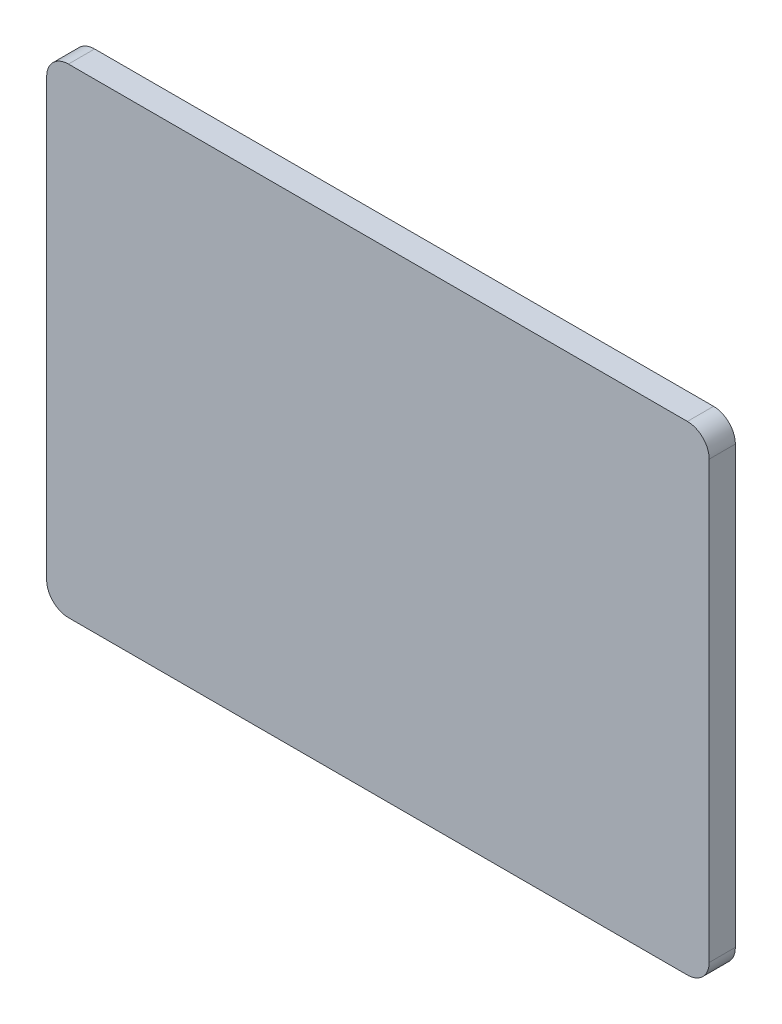
ISO-10303-21;
HEADER;
FILE_DESCRIPTION(('STEP AP214'),'2;1');
FILE_NAME('part.step','',(''),(''),'','','');
FILE_SCHEMA(('AUTOMOTIVE_DESIGN { 1 0 10303 214 1 1 1 1 }'));
ENDSEC;
DATA;
#1=APPLICATION_CONTEXT('core data for automotive mechanical design processes');
#2=APPLICATION_PROTOCOL_DEFINITION('international standard','automotive_design',2000,#1);
#3=PRODUCT_CONTEXT('',#1,'mechanical');
#4=PRODUCT('Part','Part','',(#3));
#5=PRODUCT_RELATED_PRODUCT_CATEGORY('part','',(#4));
#6=PRODUCT_DEFINITION_FORMATION('','',#4);
#7=PRODUCT_DEFINITION_CONTEXT('part definition',#1,'design');
#8=PRODUCT_DEFINITION('design','',#6,#7);
#9=PRODUCT_DEFINITION_SHAPE('','',#8);
#10=(LENGTH_UNIT() NAMED_UNIT(*) SI_UNIT(.MILLI.,.METRE.));
#11=(NAMED_UNIT(*) PLANE_ANGLE_UNIT() SI_UNIT($,.RADIAN.));
#12=(NAMED_UNIT(*) SI_UNIT($,.STERADIAN.) SOLID_ANGLE_UNIT());
#13=UNCERTAINTY_MEASURE_WITH_UNIT(LENGTH_MEASURE(1.E-05),#10,'distance_accuracy_value','');
#14=(GEOMETRIC_REPRESENTATION_CONTEXT(3) GLOBAL_UNCERTAINTY_ASSIGNED_CONTEXT((#13)) GLOBAL_UNIT_ASSIGNED_CONTEXT((#10,
#11,#12)) REPRESENTATION_CONTEXT('',''));
#15=CARTESIAN_POINT('',(0.,0.,0.));
#16=DIRECTION('',(0.,0.,1.));
#17=DIRECTION('',(1.,0.,0.));
#18=AXIS2_PLACEMENT_3D('',#15,#16,#17);
#19=CARTESIAN_POINT('',(-1.52,-1.1,0.7));
#20=DIRECTION('',(0.,0.,1.));
#21=DIRECTION('',(1.,0.,0.));
#22=AXIS2_PLACEMENT_3D('',#19,#20,#21);
#23=PLANE('',#22);
#24=CARTESIAN_POINT('',(-1.52,1.000000000006,0.7));
#25=CARTESIAN_POINT('',(-1.51999968844048,1.0056316202386,0.7));
#26=CARTESIAN_POINT('',(-1.51952299246332,1.01125312673214,0.7));
#27=CARTESIAN_POINT('',(-1.51763681382996,1.02233274194425,0.7));
#28=CARTESIAN_POINT('',(-1.5162280630371,1.02779097535536,0.7));
#29=CARTESIAN_POINT('',(-1.51064431334291,1.04368613131699,0.7));
#30=CARTESIAN_POINT('',(-1.5051115492291,1.05368086111718,0.7));
#31=CARTESIAN_POINT('',(-1.49106257026605,1.07125770138423,0.7));
#32=CARTESIAN_POINT('',(-1.48254635541698,1.07883981185122,0.7));
#33=CARTESIAN_POINT('',(-1.4634686777282,1.09075031978158,0.7));
#34=CARTESIAN_POINT('',(-1.45290721488826,1.09507871724458,0.7));
#35=CARTESIAN_POINT('',(-1.43474534601436,1.09919358451577,0.7));
#36=CARTESIAN_POINT('',(-1.42736844369791,1.10002745083091,0.7));
#37=CARTESIAN_POINT('',(-1.42000000002417,1.1,0.7));
#38=B_SPLINE_CURVE_WITH_KNOTS('',3,(#24,#25,#26,#27,#28,#29,#30,#31,#32,#33,#34,#35,#36,#37),
.UNSPECIFIED.,.F.,.F.,(4,2,2,2,2,2,4),(0.,0.0168550694012489,0.0336969196328669,
0.0672740568307237,0.100851194026678,0.134428331226493,0.156515205370961),.UNSPECIFIED.);
#39=CARTESIAN_POINT('',(-1.52,1.000000000006,0.7));
#40=VERTEX_POINT('',#39);
#41=CARTESIAN_POINT('',(-1.42,1.1,0.7));
#42=VERTEX_POINT('',#41);
#43=EDGE_CURVE('E100',#40,#42,#38,.T.);
#44=ORIENTED_EDGE('',*,*,#43,.F.);
#45=DIRECTION('',(0.,1.,0.));
#46=VECTOR('',#45,1.);
#47=CARTESIAN_POINT('',(-1.52,-1.,0.7));
#48=LINE('',#47,#46);
#49=CARTESIAN_POINT('',(-1.52,-1.00000000001208,0.7));
#50=VERTEX_POINT('',#49);
#51=EDGE_CURVE('E108',#50,#40,#48,.T.);
#52=ORIENTED_EDGE('',*,*,#51,.F.);
#53=CARTESIAN_POINT('',(-1.42,-1.1,0.7));
#54=CARTESIAN_POINT('',(-1.4256316202326,-1.09999968844081,0.7));
#55=CARTESIAN_POINT('',(-1.43125312672617,-1.09952299246399,0.7));
#56=CARTESIAN_POINT('',(-1.44233274193839,-1.0976368138313,0.7));
#57=CARTESIAN_POINT('',(-1.44779097534958,-1.09622806303877,0.7));
#58=CARTESIAN_POINT('',(-1.46368613131155,-1.09064431334553,0.7));
#59=CARTESIAN_POINT('',(-1.47368086111208,-1.08511154923233,0.7));
#60=CARTESIAN_POINT('',(-1.49125770137997,-1.07106257027033,0.7));
#61=CARTESIAN_POINT('',(-1.49883981184747,-1.06254635542171,0.7));
#62=CARTESIAN_POINT('',(-1.51075031977897,-1.04346867773365,0.7));
#63=CARTESIAN_POINT('',(-1.5150787172426,-1.03290721489397,0.7));
#64=CARTESIAN_POINT('',(-1.51919358451533,-1.01474534601836,0.7));
#65=CARTESIAN_POINT('',(-1.52002745083093,-1.00736844369991,0.7));
#66=CARTESIAN_POINT('',(-1.52,-1.00000000002417,0.7));
#67=B_SPLINE_CURVE_WITH_KNOTS('',3,(#53,#54,#55,#56,#57,#58,#59,#60,#61,#62,#63,#64,#65,#66),
.UNSPECIFIED.,.F.,.F.,(4,2,2,2,2,2,4),(0.,0.0168550694012493,0.033696919632867,
0.0672740568307241,0.100851194026678,0.134428331226493,0.156515205376924),.UNSPECIFIED.);
#68=CARTESIAN_POINT('',(-1.42,-1.1,0.7));
#69=VERTEX_POINT('',#68);
#70=EDGE_CURVE('E154',#69,#50,#67,.T.);
#71=ORIENTED_EDGE('',*,*,#70,.F.);
#72=DIRECTION('',(1.,0.,0.));
#73=VECTOR('',#72,1.);
#74=CARTESIAN_POINT('',(1.42,-1.1,0.7));
#75=LINE('',#74,#73);
#76=CARTESIAN_POINT('',(1.42000000001208,-1.1,0.7));
#77=VERTEX_POINT('',#76);
#78=EDGE_CURVE('E111',#77,#69,#75,.F.);
#79=ORIENTED_EDGE('',*,*,#78,.F.);
#80=CARTESIAN_POINT('',(1.52,-1.,0.7));
#81=CARTESIAN_POINT('',(1.51999968844081,-1.0056316202326,0.7));
#82=CARTESIAN_POINT('',(1.51952299246399,-1.01125312672617,0.7));
#83=CARTESIAN_POINT('',(1.5176368138313,-1.02233274193839,0.7));
#84=CARTESIAN_POINT('',(1.51622806303877,-1.02779097534958,0.7));
#85=CARTESIAN_POINT('',(1.51064431334553,-1.04368613131155,0.7));
#86=CARTESIAN_POINT('',(1.50511154923233,-1.05368086111208,0.7));
#87=CARTESIAN_POINT('',(1.49106257027033,-1.07125770137997,0.7));
#88=CARTESIAN_POINT('',(1.48254635542171,-1.07883981184747,0.7));
#89=CARTESIAN_POINT('',(1.46346867773365,-1.09075031977897,0.7));
#90=CARTESIAN_POINT('',(1.45290721489397,-1.0950787172426,0.7));
#91=CARTESIAN_POINT('',(1.43474534601836,-1.09919358451533,0.7));
#92=CARTESIAN_POINT('',(1.42736844369991,-1.10002745083093,0.7));
#93=CARTESIAN_POINT('',(1.42000000002417,-1.1,0.7));
#94=B_SPLINE_CURVE_WITH_KNOTS('',3,(#80,#81,#82,#83,#84,#85,#86,#87,#88,#89,#90,#91,#92,#93),
.UNSPECIFIED.,.F.,.F.,(4,2,2,2,2,2,4),(0.,0.0168550694012493,0.0336969196328673,
0.0672740568307246,0.100851194026678,0.134428331226493,0.156515205376924),.UNSPECIFIED.);
#95=CARTESIAN_POINT('',(1.52,-1.,0.7));
#96=VERTEX_POINT('',#95);
#97=EDGE_CURVE('E158',#96,#77,#94,.T.);
#98=ORIENTED_EDGE('',*,*,#97,.F.);
#99=DIRECTION('',(0.,1.,0.));
#100=VECTOR('',#99,1.);
#101=CARTESIAN_POINT('',(1.52,1.,0.7));
#102=LINE('',#101,#100);
#103=CARTESIAN_POINT('',(1.52,1.,0.7));
#104=VERTEX_POINT('',#103);
#105=EDGE_CURVE('E89',#104,#96,#102,.F.);
#106=ORIENTED_EDGE('',*,*,#105,.F.);
#107=CARTESIAN_POINT('',(1.42,1.1,0.7));
#108=CARTESIAN_POINT('',(1.4256316202326,1.09999968844081,0.7));
#109=CARTESIAN_POINT('',(1.43125312672617,1.09952299246399,0.7));
#110=CARTESIAN_POINT('',(1.44233274193839,1.0976368138313,0.7));
#111=CARTESIAN_POINT('',(1.44779097534958,1.09622806303877,0.7));
#112=CARTESIAN_POINT('',(1.46368613131155,1.09064431334553,0.7));
#113=CARTESIAN_POINT('',(1.47368086111208,1.08511154923233,0.7));
#114=CARTESIAN_POINT('',(1.49125770137997,1.07106257027033,0.7));
#115=CARTESIAN_POINT('',(1.49883981184747,1.06254635542171,0.7));
#116=CARTESIAN_POINT('',(1.51075031977897,1.04346867773365,0.7));
#117=CARTESIAN_POINT('',(1.5150787172426,1.03290721489397,0.7));
#118=CARTESIAN_POINT('',(1.51919358451533,1.01474534601836,0.7));
#119=CARTESIAN_POINT('',(1.52002745083093,1.00736844369991,0.7));
#120=CARTESIAN_POINT('',(1.52,1.00000000002417,0.7));
#121=B_SPLINE_CURVE_WITH_KNOTS('',3,(#107,#108,#109,#110,#111,#112,#113,#114,#115,#116,#117,
#118,#119,#120),.UNSPECIFIED.,.F.,.F.,(4,2,2,2,2,2,4),(0.,0.0168550694012493,0.0336969196328672,
0.0672740568307246,0.100851194026679,0.134428331226493,0.156515205376924),.UNSPECIFIED.);
#122=CARTESIAN_POINT('',(1.42,1.1,0.7));
#123=VERTEX_POINT('',#122);
#124=EDGE_CURVE('E21',#123,#104,#121,.T.);
#125=ORIENTED_EDGE('',*,*,#124,.F.);
#126=DIRECTION('',(1.,0.,0.));
#127=VECTOR('',#126,1.);
#128=CARTESIAN_POINT('',(-1.42,1.1,0.7));
#129=LINE('',#128,#127);
#130=EDGE_CURVE('E87',#42,#123,#129,.T.);
#131=ORIENTED_EDGE('',*,*,#130,.F.);
#132=EDGE_LOOP('',(#44,#52,#71,#79,#98,#106,#125,#131));
#133=FACE_BOUND('',#132,.T.);
#134=ADVANCED_FACE('F17',(#133),#23,.T.);
#135=CARTESIAN_POINT('',(1.418585786438,1.1,0.58));
#136=CARTESIAN_POINT('',(1.419292893219,1.1,0.58));
#137=CARTESIAN_POINT('',(1.42,1.1,0.58));
#138=CARTESIAN_POINT('',(1.52,1.1,0.58));
#139=CARTESIAN_POINT('',(1.52,1.,0.58));
#140=CARTESIAN_POINT('',(1.418585786438,1.1,0.62));
#141=CARTESIAN_POINT('',(1.419292893219,1.1,0.62));
#142=CARTESIAN_POINT('',(1.42,1.1,0.62));
#143=CARTESIAN_POINT('',(1.52,1.1,0.62));
#144=CARTESIAN_POINT('',(1.52,1.,0.62));
#145=CARTESIAN_POINT('',(1.418585786438,1.1,0.66));
#146=CARTESIAN_POINT('',(1.419292893219,1.1,0.66));
#147=CARTESIAN_POINT('',(1.42,1.1,0.66));
#148=CARTESIAN_POINT('',(1.52,1.1,0.66));
#149=CARTESIAN_POINT('',(1.52,1.,0.66));
#150=CARTESIAN_POINT('',(1.418585786438,1.1,0.7));
#151=CARTESIAN_POINT('',(1.419292893219,1.1,0.7));
#152=CARTESIAN_POINT('',(1.42,1.1,0.7));
#153=CARTESIAN_POINT('',(1.52,1.1,0.7));
#154=CARTESIAN_POINT('',(1.52,1.,0.7));
#155=(BOUNDED_SURFACE() B_SPLINE_SURFACE(3,2,((#135,#136,#137,#138,#139),(#140,#141,#142,#143,
#144),(#145,#146,#147,#148,#149),(#150,#151,#152,#153,#154)),.UNSPECIFIED.,.F.,.F.,
.F.) B_SPLINE_SURFACE_WITH_KNOTS((4,4),(3,2,3),(0.,0.12),(-0.01,0.,1.),
.UNSPECIFIED.) GEOMETRIC_REPRESENTATION_ITEM() RATIONAL_B_SPLINE_SURFACE(((1.,1.,1.,
0.707106781187,1.),(1.,1.,1.,0.707106781187,1.),(1.,1.,1.,0.707106781187,1.),(1.,1.,1.,
0.707106781187,1.))) REPRESENTATION_ITEM('') SURFACE());
#156=DIRECTION('',(0.,0.,1.));
#157=VECTOR('',#156,1.);
#158=CARTESIAN_POINT('',(1.42,1.1,0.58));
#159=LINE('',#158,#157);
#160=CARTESIAN_POINT('',(1.42,1.1,0.58));
#161=VERTEX_POINT('',#160);
#162=EDGE_CURVE('E93',#123,#161,#159,.F.);
#163=DIRECTION('',(0.,0.,-1.));
#164=VECTOR('',#163,1.);
#165=CARTESIAN_POINT('',(1.52,1.,0.58));
#166=LINE('',#165,#164);
#167=CARTESIAN_POINT('',(1.52,1.,0.58));
#168=VERTEX_POINT('',#167);
#169=EDGE_CURVE('E106',#168,#104,#166,.F.);
#170=CARTESIAN_POINT('',(1.42,1.1,0.58));
#171=CARTESIAN_POINT('',(1.4256316202326,1.09999968844081,0.58));
#172=CARTESIAN_POINT('',(1.43125312672617,1.09952299246399,0.58));
#173=CARTESIAN_POINT('',(1.44233274193839,1.0976368138313,0.58));
#174=CARTESIAN_POINT('',(1.44779097534958,1.09622806303877,0.58));
#175=CARTESIAN_POINT('',(1.46368613131155,1.09064431334553,0.58));
#176=CARTESIAN_POINT('',(1.47368086111208,1.08511154923233,0.58));
#177=CARTESIAN_POINT('',(1.49125770137997,1.07106257027033,0.58));
#178=CARTESIAN_POINT('',(1.49883981184747,1.06254635542171,0.58));
#179=CARTESIAN_POINT('',(1.51075031977897,1.04346867773365,0.58));
#180=CARTESIAN_POINT('',(1.5150787172426,1.03290721489397,0.58));
#181=CARTESIAN_POINT('',(1.51919358451533,1.01474534601836,0.58));
#182=CARTESIAN_POINT('',(1.52002745083093,1.00736844369991,0.58));
#183=CARTESIAN_POINT('',(1.52,1.00000000002417,0.58));
#184=B_SPLINE_CURVE_WITH_KNOTS('',3,(#170,#171,#172,#173,#174,#175,#176,#177,#178,#179,#180,
#181,#182,#183),.UNSPECIFIED.,.F.,.F.,(4,2,2,2,2,2,4),(0.,0.0168550694012497,0.0336969196328675,
0.0672740568307245,0.100851194026679,0.134428331226494,0.156515205376924),.UNSPECIFIED.);
#185=EDGE_CURVE('E96',#161,#168,#184,.T.);
#186=ORIENTED_EDGE('',*,*,#162,.F.);
#187=ORIENTED_EDGE('',*,*,#124,.T.);
#188=ORIENTED_EDGE('',*,*,#169,.F.);
#189=ORIENTED_EDGE('',*,*,#185,.F.);
#190=EDGE_LOOP('',(#186,#187,#188,#189));
#191=FACE_BOUND('',#190,.T.);
#192=ADVANCED_FACE('F94',(#191),#155,.T.);
#193=CARTESIAN_POINT('',(1.52,1.,0.58));
#194=DIRECTION('',(1.,0.,0.));
#195=DIRECTION('',(0.,0.,-1.));
#196=AXIS2_PLACEMENT_3D('',#193,#194,#195);
#197=PLANE('',#196);
#198=DIRECTION('',(0.,1.,0.));
#199=VECTOR('',#198,1.);
#200=CARTESIAN_POINT('',(1.52,-1.1,0.58));
#201=LINE('',#200,#199);
#202=CARTESIAN_POINT('',(1.52,-1.,0.58));
#203=VERTEX_POINT('',#202);
#204=EDGE_CURVE('E199',#168,#203,#201,.F.);
#205=ORIENTED_EDGE('',*,*,#204,.F.);
#206=ORIENTED_EDGE('',*,*,#169,.T.);
#207=ORIENTED_EDGE('',*,*,#105,.T.);
#208=DIRECTION('',(0.,0.,1.));
#209=VECTOR('',#208,1.);
#210=CARTESIAN_POINT('',(1.52,-1.,0.64));
#211=LINE('',#210,#209);
#212=EDGE_CURVE('E217',#203,#96,#211,.T.);
#213=ORIENTED_EDGE('',*,*,#212,.F.);
#214=EDGE_LOOP('',(#205,#206,#207,#213));
#215=FACE_BOUND('',#214,.T.);
#216=ADVANCED_FACE('F185',(#215),#197,.T.);
#217=CARTESIAN_POINT('',(1.52,-0.998585786438,0.58));
#218=CARTESIAN_POINT('',(1.52,-0.999292893219,0.58));
#219=CARTESIAN_POINT('',(1.52,-1.,0.58));
#220=CARTESIAN_POINT('',(1.52,-1.1,0.58));
#221=CARTESIAN_POINT('',(1.42,-1.1,0.58));
#222=CARTESIAN_POINT('',(1.52,-0.998585786438,0.62));
#223=CARTESIAN_POINT('',(1.52,-0.999292893219,0.62));
#224=CARTESIAN_POINT('',(1.52,-1.,0.62));
#225=CARTESIAN_POINT('',(1.52,-1.1,0.62));
#226=CARTESIAN_POINT('',(1.42,-1.1,0.62));
#227=CARTESIAN_POINT('',(1.52,-0.998585786438,0.66));
#228=CARTESIAN_POINT('',(1.52,-0.999292893219,0.66));
#229=CARTESIAN_POINT('',(1.52,-1.,0.66));
#230=CARTESIAN_POINT('',(1.52,-1.1,0.66));
#231=CARTESIAN_POINT('',(1.42,-1.1,0.66));
#232=CARTESIAN_POINT('',(1.52,-0.998585786438,0.7));
#233=CARTESIAN_POINT('',(1.52,-0.999292893219,0.7));
#234=CARTESIAN_POINT('',(1.52,-1.,0.7));
#235=CARTESIAN_POINT('',(1.52,-1.1,0.7));
#236=CARTESIAN_POINT('',(1.42,-1.1,0.7));
#237=(BOUNDED_SURFACE() B_SPLINE_SURFACE(3,2,((#217,#218,#219,#220,#221),(#222,#223,#224,#225,
#226),(#227,#228,#229,#230,#231),(#232,#233,#234,#235,#236)),.UNSPECIFIED.,.F.,.F.,
.F.) B_SPLINE_SURFACE_WITH_KNOTS((4,4),(3,2,3),(0.,0.12),(-0.01,0.,1.),
.UNSPECIFIED.) GEOMETRIC_REPRESENTATION_ITEM() RATIONAL_B_SPLINE_SURFACE(((1.,1.,1.,
0.707106781187,1.),(1.,1.,1.,0.707106781187,1.),(1.,1.,1.,0.707106781187,1.),(1.,1.,1.,
0.707106781187,1.))) REPRESENTATION_ITEM('') SURFACE());
#238=DIRECTION('',(0.,0.,-1.));
#239=VECTOR('',#238,1.);
#240=CARTESIAN_POINT('',(1.42,-1.1,0.58));
#241=LINE('',#240,#239);
#242=CARTESIAN_POINT('',(1.42,-1.1,0.58));
#243=VERTEX_POINT('',#242);
#244=EDGE_CURVE('E114',#243,#77,#241,.F.);
#245=CARTESIAN_POINT('',(1.52,-1.,0.58));
#246=CARTESIAN_POINT('',(1.51999968844081,-1.0056316202326,0.58));
#247=CARTESIAN_POINT('',(1.51952299246399,-1.01125312672617,0.58));
#248=CARTESIAN_POINT('',(1.5176368138313,-1.02233274193839,0.58));
#249=CARTESIAN_POINT('',(1.51622806303877,-1.02779097534958,0.58));
#250=CARTESIAN_POINT('',(1.51064431334553,-1.04368613131155,0.58));
#251=CARTESIAN_POINT('',(1.50511154923233,-1.05368086111208,0.58));
#252=CARTESIAN_POINT('',(1.49106257027033,-1.07125770137997,0.58));
#253=CARTESIAN_POINT('',(1.48254635542171,-1.07883981184747,0.58));
#254=CARTESIAN_POINT('',(1.46346867773365,-1.09075031977897,0.58));
#255=CARTESIAN_POINT('',(1.45290721489397,-1.0950787172426,0.58));
#256=CARTESIAN_POINT('',(1.43474534601836,-1.09919358451533,0.58));
#257=CARTESIAN_POINT('',(1.42736844369991,-1.10002745083093,0.58));
#258=CARTESIAN_POINT('',(1.42000000002417,-1.1,0.58));
#259=B_SPLINE_CURVE_WITH_KNOTS('',3,(#245,#246,#247,#248,#249,#250,#251,#252,#253,#254,#255,
#256,#257,#258),.UNSPECIFIED.,.F.,.F.,(4,2,2,2,2,2,4),(0.,0.0168550694012493,0.0336969196328673,
0.0672740568307245,0.100851194026678,0.134428331226493,0.156515205376924),.UNSPECIFIED.);
#260=EDGE_CURVE('E193',#203,#243,#259,.T.);
#261=ORIENTED_EDGE('',*,*,#212,.T.);
#262=ORIENTED_EDGE('',*,*,#97,.T.);
#263=ORIENTED_EDGE('',*,*,#244,.F.);
#264=ORIENTED_EDGE('',*,*,#260,.F.);
#265=EDGE_LOOP('',(#261,#262,#263,#264));
#266=FACE_BOUND('',#265,.T.);
#267=ADVANCED_FACE('F178',(#266),#237,.T.);
#268=CARTESIAN_POINT('',(1.42,-1.1,0.58));
#269=DIRECTION('',(0.,-1.,0.));
#270=DIRECTION('',(0.,0.,-1.));
#271=AXIS2_PLACEMENT_3D('',#268,#269,#270);
#272=PLANE('',#271);
#273=ORIENTED_EDGE('',*,*,#244,.T.);
#274=ORIENTED_EDGE('',*,*,#78,.T.);
#275=DIRECTION('',(0.,0.,1.));
#276=VECTOR('',#275,1.);
#277=CARTESIAN_POINT('',(-1.42,-1.1,0.64));
#278=LINE('',#277,#276);
#279=CARTESIAN_POINT('',(-1.420000000003,-1.1,0.58));
#280=VERTEX_POINT('',#279);
#281=EDGE_CURVE('E113',#280,#69,#278,.T.);
#282=ORIENTED_EDGE('',*,*,#281,.F.);
#283=DIRECTION('',(-1.,0.,0.));
#284=VECTOR('',#283,1.);
#285=CARTESIAN_POINT('',(-1.52,-1.1,0.58));
#286=LINE('',#285,#284);
#287=EDGE_CURVE('E198',#243,#280,#286,.T.);
#288=ORIENTED_EDGE('',*,*,#287,.F.);
#289=EDGE_LOOP('',(#273,#274,#282,#288));
#290=FACE_BOUND('',#289,.T.);
#291=ADVANCED_FACE('F169',(#290),#272,.T.);
#292=CARTESIAN_POINT('',(-1.52,-0.998585786438,0.7));
#293=CARTESIAN_POINT('',(-1.52,-0.999292893219,0.7));
#294=CARTESIAN_POINT('',(-1.52,-1.,0.7));
#295=CARTESIAN_POINT('',(-1.52,-1.1,0.7));
#296=CARTESIAN_POINT('',(-1.42,-1.1,0.7));
#297=CARTESIAN_POINT('',(-1.52,-0.998585786438,0.66));
#298=CARTESIAN_POINT('',(-1.52,-0.999292893219,0.66));
#299=CARTESIAN_POINT('',(-1.52,-1.,0.66));
#300=CARTESIAN_POINT('',(-1.52,-1.1,0.66));
#301=CARTESIAN_POINT('',(-1.42,-1.1,0.66));
#302=CARTESIAN_POINT('',(-1.52,-0.998585786438,0.62));
#303=CARTESIAN_POINT('',(-1.52,-0.999292893219,0.62));
#304=CARTESIAN_POINT('',(-1.52,-1.,0.62));
#305=CARTESIAN_POINT('',(-1.52,-1.1,0.62));
#306=CARTESIAN_POINT('',(-1.42,-1.1,0.62));
#307=CARTESIAN_POINT('',(-1.52,-0.998585786438,0.58));
#308=CARTESIAN_POINT('',(-1.52,-0.999292893219,0.58));
#309=CARTESIAN_POINT('',(-1.52,-1.,0.58));
#310=CARTESIAN_POINT('',(-1.52,-1.1,0.58));
#311=CARTESIAN_POINT('',(-1.42,-1.1,0.58));
#312=(BOUNDED_SURFACE() B_SPLINE_SURFACE(3,2,((#292,#293,#294,#295,#296),(#297,#298,#299,#300,
#301),(#302,#303,#304,#305,#306),(#307,#308,#309,#310,#311)),.UNSPECIFIED.,.F.,.F.,
.F.) B_SPLINE_SURFACE_WITH_KNOTS((4,4),(3,2,3),(0.,0.12),(-0.01,0.,1.),
.UNSPECIFIED.) GEOMETRIC_REPRESENTATION_ITEM() RATIONAL_B_SPLINE_SURFACE(((1.,1.,1.,
0.707106781187,1.),(1.,1.,1.,0.707106781187,1.),(1.,1.,1.,0.707106781187,1.),(1.,1.,1.,
0.707106781187,1.))) REPRESENTATION_ITEM('') SURFACE());
#313=DIRECTION('',(0.,0.,1.));
#314=VECTOR('',#313,1.);
#315=CARTESIAN_POINT('',(-1.52,-1.,0.58));
#316=LINE('',#315,#314);
#317=CARTESIAN_POINT('',(-1.52,-1.,0.58));
#318=VERTEX_POINT('',#317);
#319=EDGE_CURVE('E110',#318,#50,#316,.T.);
#320=CARTESIAN_POINT('',(-1.420000000006,-1.1,0.58));
#321=CARTESIAN_POINT('',(-1.4256316202386,-1.09999968844048,0.58));
#322=CARTESIAN_POINT('',(-1.43125312673214,-1.09952299246332,0.58));
#323=CARTESIAN_POINT('',(-1.44233274194425,-1.09763681382996,0.58));
#324=CARTESIAN_POINT('',(-1.44779097535536,-1.0962280630371,0.58));
#325=CARTESIAN_POINT('',(-1.46368613131699,-1.09064431334291,0.58));
#326=CARTESIAN_POINT('',(-1.47368086111718,-1.0851115492291,0.58));
#327=CARTESIAN_POINT('',(-1.49125770138423,-1.07106257026605,0.58));
#328=CARTESIAN_POINT('',(-1.49883981185122,-1.06254635541698,0.58));
#329=CARTESIAN_POINT('',(-1.51075031978158,-1.0434686777282,0.58));
#330=CARTESIAN_POINT('',(-1.51507871724458,-1.03290721488826,0.58));
#331=CARTESIAN_POINT('',(-1.51919358451577,-1.01474534601436,0.58));
#332=CARTESIAN_POINT('',(-1.52002745083091,-1.00736844369791,0.58));
#333=CARTESIAN_POINT('',(-1.52,-1.00000000002417,0.58));
#334=B_SPLINE_CURVE_WITH_KNOTS('',3,(#320,#321,#322,#323,#324,#325,#326,#327,#328,#329,#330,
#331,#332,#333),.UNSPECIFIED.,.F.,.F.,(4,2,2,2,2,2,4),(0.,0.0168550694012487,0.0336969196328666,
0.0672740568307233,0.100851194026677,0.134428331226492,0.15651520537096),.UNSPECIFIED.);
#335=EDGE_CURVE('E124',#280,#318,#334,.T.);
#336=ORIENTED_EDGE('',*,*,#319,.F.);
#337=ORIENTED_EDGE('',*,*,#335,.F.);
#338=ORIENTED_EDGE('',*,*,#281,.T.);
#339=ORIENTED_EDGE('',*,*,#70,.T.);
#340=EDGE_LOOP('',(#336,#337,#338,#339));
#341=FACE_BOUND('',#340,.T.);
#342=ADVANCED_FACE('F163',(#341),#312,.T.);
#343=CARTESIAN_POINT('',(-1.52,-1.,0.58));
#344=DIRECTION('',(-1.,0.,0.));
#345=DIRECTION('',(0.,0.,1.));
#346=AXIS2_PLACEMENT_3D('',#343,#344,#345);
#347=PLANE('',#346);
#348=ORIENTED_EDGE('',*,*,#51,.T.);
#349=DIRECTION('',(0.,0.,1.));
#350=VECTOR('',#349,1.);
#351=CARTESIAN_POINT('',(-1.52,1.000000000012,0.64));
#352=LINE('',#351,#350);
#353=CARTESIAN_POINT('',(-1.52,1.000000000012,0.58));
#354=VERTEX_POINT('',#353);
#355=EDGE_CURVE('E102',#354,#40,#352,.T.);
#356=ORIENTED_EDGE('',*,*,#355,.F.);
#357=DIRECTION('',(0.,1.,0.));
#358=VECTOR('',#357,1.);
#359=CARTESIAN_POINT('',(-1.52,-1.1,0.58));
#360=LINE('',#359,#358);
#361=EDGE_CURVE('E123',#318,#354,#360,.T.);
#362=ORIENTED_EDGE('',*,*,#361,.F.);
#363=ORIENTED_EDGE('',*,*,#319,.T.);
#364=EDGE_LOOP('',(#348,#356,#362,#363));
#365=FACE_BOUND('',#364,.T.);
#366=ADVANCED_FACE('F139',(#365),#347,.T.);
#367=CARTESIAN_POINT('',(-1.52,0.998585786438,0.58));
#368=CARTESIAN_POINT('',(-1.52,0.999292893219,0.58));
#369=CARTESIAN_POINT('',(-1.52,1.,0.58));
#370=CARTESIAN_POINT('',(-1.52,1.1,0.58));
#371=CARTESIAN_POINT('',(-1.42,1.1,0.58));
#372=CARTESIAN_POINT('',(-1.52,0.998585786438,0.62));
#373=CARTESIAN_POINT('',(-1.52,0.999292893219,0.62));
#374=CARTESIAN_POINT('',(-1.52,1.,0.62));
#375=CARTESIAN_POINT('',(-1.52,1.1,0.62));
#376=CARTESIAN_POINT('',(-1.42,1.1,0.62));
#377=CARTESIAN_POINT('',(-1.52,0.998585786438,0.66));
#378=CARTESIAN_POINT('',(-1.52,0.999292893219,0.66));
#379=CARTESIAN_POINT('',(-1.52,1.,0.66));
#380=CARTESIAN_POINT('',(-1.52,1.1,0.66));
#381=CARTESIAN_POINT('',(-1.42,1.1,0.66));
#382=CARTESIAN_POINT('',(-1.52,0.998585786438,0.7));
#383=CARTESIAN_POINT('',(-1.52,0.999292893219,0.7));
#384=CARTESIAN_POINT('',(-1.52,1.,0.7));
#385=CARTESIAN_POINT('',(-1.52,1.1,0.7));
#386=CARTESIAN_POINT('',(-1.42,1.1,0.7));
#387=(BOUNDED_SURFACE() B_SPLINE_SURFACE(3,2,((#367,#368,#369,#370,#371),(#372,#373,#374,#375,
#376),(#377,#378,#379,#380,#381),(#382,#383,#384,#385,#386)),.UNSPECIFIED.,.F.,.F.,
.F.) B_SPLINE_SURFACE_WITH_KNOTS((4,4),(3,2,3),(0.,0.12),(-0.01,0.,1.),
.UNSPECIFIED.) GEOMETRIC_REPRESENTATION_ITEM() RATIONAL_B_SPLINE_SURFACE(((1.,1.,1.,
0.707106781187,1.),(1.,1.,1.,0.707106781187,1.),(1.,1.,1.,0.707106781187,1.),(1.,1.,1.,
0.707106781187,1.))) REPRESENTATION_ITEM('') SURFACE());
#388=DIRECTION('',(0.,0.,1.));
#389=VECTOR('',#388,1.);
#390=CARTESIAN_POINT('',(-1.42,1.1,0.58));
#391=LINE('',#390,#389);
#392=CARTESIAN_POINT('',(-1.42,1.1,0.58));
#393=VERTEX_POINT('',#392);
#394=EDGE_CURVE('E39',#393,#42,#391,.T.);
#395=CARTESIAN_POINT('',(-1.52,1.000000000012,0.58));
#396=CARTESIAN_POINT('',(-1.51999968844014,1.0056316202446,0.58));
#397=CARTESIAN_POINT('',(-1.51952299246264,1.01125312673811,0.58));
#398=CARTESIAN_POINT('',(-1.51763681382862,1.02233274195011,0.58));
#399=CARTESIAN_POINT('',(-1.51622806303544,1.02779097536113,0.58));
#400=CARTESIAN_POINT('',(-1.51064431334029,1.04368613132242,0.58));
#401=CARTESIAN_POINT('',(-1.50511154922588,1.05368086112229,0.58));
#402=CARTESIAN_POINT('',(-1.49106257026178,1.0712577013885,0.58));
#403=CARTESIAN_POINT('',(-1.48254635541225,1.07883981185497,0.58));
#404=CARTESIAN_POINT('',(-1.46346867772276,1.09075031978419,0.58));
#405=CARTESIAN_POINT('',(-1.45290721488255,1.09507871724656,0.58));
#406=CARTESIAN_POINT('',(-1.43474534601036,1.09919358451621,0.58));
#407=CARTESIAN_POINT('',(-1.4273684436959,1.10002745083089,0.58));
#408=CARTESIAN_POINT('',(-1.42000000002417,1.1,0.58));
#409=B_SPLINE_CURVE_WITH_KNOTS('',3,(#395,#396,#397,#398,#399,#400,#401,#402,#403,#404,#405,
#406,#407,#408),.UNSPECIFIED.,.F.,.F.,(4,2,2,2,2,2,4),(0.,0.0168550694012489,0.0336969196328669,
0.0672740568307234,0.100851194026678,0.134428331226493,0.156515205364997),.UNSPECIFIED.);
#410=EDGE_CURVE('E30',#354,#393,#409,.T.);
#411=ORIENTED_EDGE('',*,*,#355,.T.);
#412=ORIENTED_EDGE('',*,*,#43,.T.);
#413=ORIENTED_EDGE('',*,*,#394,.F.);
#414=ORIENTED_EDGE('',*,*,#410,.F.);
#415=EDGE_LOOP('',(#411,#412,#413,#414));
#416=FACE_BOUND('',#415,.T.);
#417=ADVANCED_FACE('F133',(#416),#387,.T.);
#418=CARTESIAN_POINT('',(-1.42,1.1,0.58));
#419=DIRECTION('',(0.,1.,0.));
#420=DIRECTION('',(0.,0.,1.));
#421=AXIS2_PLACEMENT_3D('',#418,#419,#420);
#422=PLANE('',#421);
#423=DIRECTION('',(-1.,0.,0.));
#424=VECTOR('',#423,1.);
#425=CARTESIAN_POINT('',(-1.52,1.1,0.58));
#426=LINE('',#425,#424);
#427=EDGE_CURVE('E11',#393,#161,#426,.F.);
#428=ORIENTED_EDGE('',*,*,#427,.F.);
#429=ORIENTED_EDGE('',*,*,#394,.T.);
#430=ORIENTED_EDGE('',*,*,#130,.T.);
#431=ORIENTED_EDGE('',*,*,#162,.T.);
#432=EDGE_LOOP('',(#428,#429,#430,#431));
#433=FACE_BOUND('',#432,.T.);
#434=ADVANCED_FACE('F99',(#433),#422,.T.);
#435=CARTESIAN_POINT('',(-1.52,-1.1,0.58));
#436=DIRECTION('',(0.,0.,-1.));
#437=DIRECTION('',(-1.,0.,0.));
#438=AXIS2_PLACEMENT_3D('',#435,#436,#437);
#439=PLANE('',#438);
#440=ORIENTED_EDGE('',*,*,#410,.T.);
#441=ORIENTED_EDGE('',*,*,#427,.T.);
#442=ORIENTED_EDGE('',*,*,#185,.T.);
#443=ORIENTED_EDGE('',*,*,#204,.T.);
#444=ORIENTED_EDGE('',*,*,#260,.T.);
#445=ORIENTED_EDGE('',*,*,#287,.T.);
#446=ORIENTED_EDGE('',*,*,#335,.T.);
#447=ORIENTED_EDGE('',*,*,#361,.T.);
#448=EDGE_LOOP('',(#440,#441,#442,#443,#444,#445,#446,#447));
#449=FACE_BOUND('',#448,.T.);
#450=ADVANCED_FACE('F130',(#449),#439,.T.);
#451=CLOSED_SHELL('',(#134,#192,#216,#267,#291,#342,#366,#417,#434,#450));
#452=MANIFOLD_SOLID_BREP('B1',#451);
#453=ADVANCED_BREP_SHAPE_REPRESENTATION('',(#18,#452),#14);
#454=SHAPE_DEFINITION_REPRESENTATION(#9,#453);
ENDSEC;
END-ISO-10303-21;
